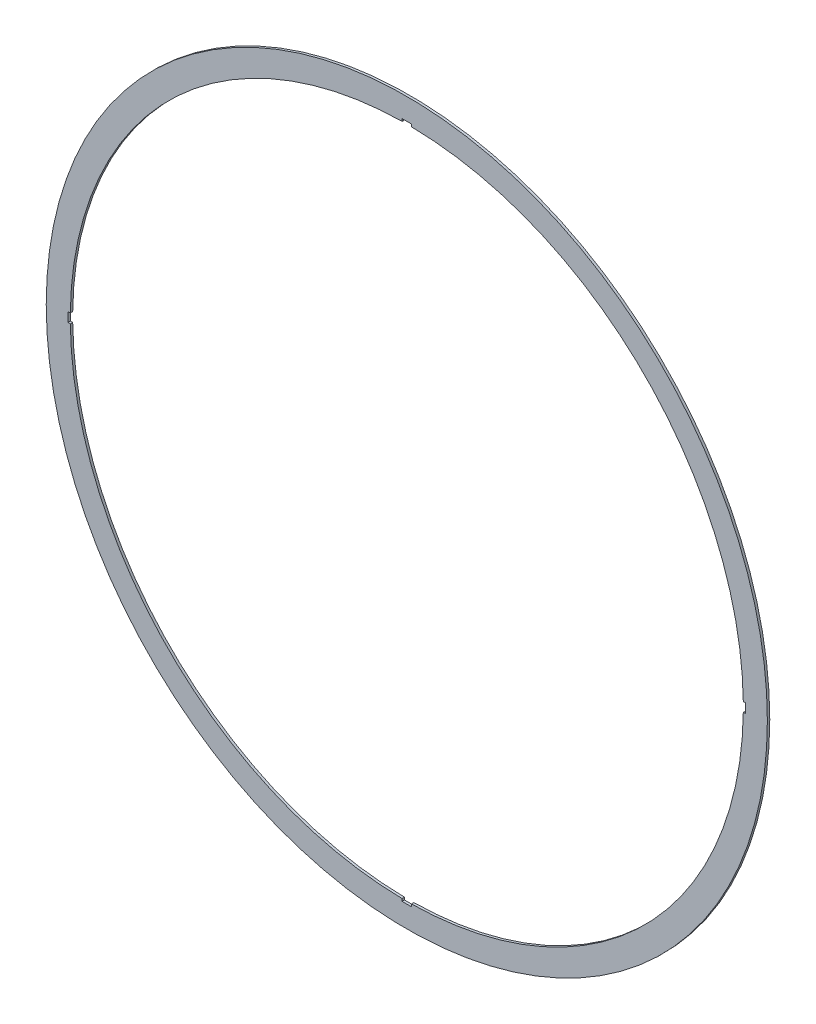
ISO-10303-21;
HEADER;
FILE_DESCRIPTION(('STEP AP214'),'2;1');
FILE_NAME('part.step','',(''),(''),'','','');
FILE_SCHEMA(('AUTOMOTIVE_DESIGN { 1 0 10303 214 1 1 1 1 }'));
ENDSEC;
DATA;
#1=APPLICATION_CONTEXT('core data for automotive mechanical design processes');
#2=APPLICATION_PROTOCOL_DEFINITION('international standard','automotive_design',2000,#1);
#3=PRODUCT_CONTEXT('',#1,'mechanical');
#4=PRODUCT('Part','Part','',(#3));
#5=PRODUCT_RELATED_PRODUCT_CATEGORY('part','',(#4));
#6=PRODUCT_DEFINITION_FORMATION('','',#4);
#7=PRODUCT_DEFINITION_CONTEXT('part definition',#1,'design');
#8=PRODUCT_DEFINITION('design','',#6,#7);
#9=PRODUCT_DEFINITION_SHAPE('','',#8);
#10=(LENGTH_UNIT() NAMED_UNIT(*) SI_UNIT(.MILLI.,.METRE.));
#11=(NAMED_UNIT(*) PLANE_ANGLE_UNIT() SI_UNIT($,.RADIAN.));
#12=(NAMED_UNIT(*) SI_UNIT($,.STERADIAN.) SOLID_ANGLE_UNIT());
#13=UNCERTAINTY_MEASURE_WITH_UNIT(LENGTH_MEASURE(1.E-05),#10,'distance_accuracy_value','');
#14=(GEOMETRIC_REPRESENTATION_CONTEXT(3) GLOBAL_UNCERTAINTY_ASSIGNED_CONTEXT((#13)) GLOBAL_UNIT_ASSIGNED_CONTEXT((#10,
#11,#12)) REPRESENTATION_CONTEXT('',''));
#15=CARTESIAN_POINT('',(0.,0.,0.));
#16=DIRECTION('',(0.,0.,1.));
#17=DIRECTION('',(1.,0.,0.));
#18=AXIS2_PLACEMENT_3D('',#15,#16,#17);
#19=CARTESIAN_POINT('',(0.,0.,3.));
#20=DIRECTION('',(0.,0.,1.));
#21=DIRECTION('',(1.,0.,0.));
#22=AXIS2_PLACEMENT_3D('',#19,#20,#21);
#23=PLANE('',#22);
#24=CARTESIAN_POINT('',(0.,0.,3.));
#25=DIRECTION('',(0.,0.,1.));
#26=DIRECTION('',(1.,0.,0.));
#27=AXIS2_PLACEMENT_3D('',#24,#25,#26);
#28=CIRCLE('',#27,450.);
#29=CARTESIAN_POINT('',(450.,0.,3.));
#30=VERTEX_POINT('',#29);
#31=EDGE_CURVE('E11',#30,#30,#28,.T.);
#32=ORIENTED_EDGE('',*,*,#31,.T.);
#33=EDGE_LOOP('',(#32));
#34=FACE_BOUND('',#33,.T.);
#35=CARTESIAN_POINT('',(0.,0.,3.));
#36=DIRECTION('',(0.,0.,1.));
#37=DIRECTION('',(1.,0.,0.));
#38=AXIS2_PLACEMENT_3D('',#35,#36,#37);
#39=CIRCLE('',#38,420.);
#40=CARTESIAN_POINT('',(-5.86046511627899,419.959111043707,3.));
#41=VERTEX_POINT('',#40);
#42=CARTESIAN_POINT('',(-419.959111043708,5.86046511626075,3.));
#43=VERTEX_POINT('',#42);
#44=EDGE_CURVE('E162',#41,#43,#39,.T.);
#45=ORIENTED_EDGE('',*,*,#44,.F.);
#46=DIRECTION('',(0.,-1.,0.));
#47=VECTOR('',#46,1.);
#48=CARTESIAN_POINT('',(-5.86046511627903,423.000973546597,3.));
#49=LINE('',#48,#47);
#50=CARTESIAN_POINT('',(-5.86046511627903,423.000973546597,3.));
#51=VERTEX_POINT('',#50);
#52=EDGE_CURVE('E153',#51,#41,#49,.T.);
#53=ORIENTED_EDGE('',*,*,#52,.F.);
#54=DIRECTION('',(-1.,0.,0.));
#55=VECTOR('',#54,1.);
#56=CARTESIAN_POINT('',(-5.86046511627903,423.000973546597,3.));
#57=LINE('',#56,#55);
#58=CARTESIAN_POINT('',(5.86046511626083,423.000973546597,3.));
#59=VERTEX_POINT('',#58);
#60=EDGE_CURVE('E217',#59,#51,#57,.T.);
#61=ORIENTED_EDGE('',*,*,#60,.F.);
#62=DIRECTION('',(0.,1.,0.));
#63=VECTOR('',#62,1.);
#64=CARTESIAN_POINT('',(5.86046511626083,423.000973546597,3.));
#65=LINE('',#64,#63);
#66=CARTESIAN_POINT('',(5.86046511626083,419.959111043708,3.));
#67=VERTEX_POINT('',#66);
#68=EDGE_CURVE('E214',#67,#59,#65,.T.);
#69=ORIENTED_EDGE('',*,*,#68,.F.);
#70=CARTESIAN_POINT('',(0.,0.,3.));
#71=DIRECTION('',(0.,0.,1.));
#72=DIRECTION('',(1.,0.,0.));
#73=AXIS2_PLACEMENT_3D('',#70,#71,#72);
#74=CIRCLE('',#73,420.);
#75=CARTESIAN_POINT('',(419.959111043707,5.86046511627906,3.));
#76=VERTEX_POINT('',#75);
#77=EDGE_CURVE('E211',#76,#67,#74,.T.);
#78=ORIENTED_EDGE('',*,*,#77,.F.);
#79=DIRECTION('',(-1.,0.,0.));
#80=VECTOR('',#79,1.);
#81=CARTESIAN_POINT('',(423.000973546597,5.86046511627905,3.));
#82=LINE('',#81,#80);
#83=CARTESIAN_POINT('',(423.000973546597,5.86046511627905,3.));
#84=VERTEX_POINT('',#83);
#85=EDGE_CURVE('E208',#84,#76,#82,.T.);
#86=ORIENTED_EDGE('',*,*,#85,.F.);
#87=DIRECTION('',(0.,1.,0.));
#88=VECTOR('',#87,1.);
#89=CARTESIAN_POINT('',(423.000973546597,5.86046511627905,3.));
#90=LINE('',#89,#88);
#91=CARTESIAN_POINT('',(423.000973546597,-5.8604651162608,3.));
#92=VERTEX_POINT('',#91);
#93=EDGE_CURVE('E205',#92,#84,#90,.T.);
#94=ORIENTED_EDGE('',*,*,#93,.F.);
#95=DIRECTION('',(1.,0.,0.));
#96=VECTOR('',#95,1.);
#97=CARTESIAN_POINT('',(423.000973546597,-5.8604651162608,3.));
#98=LINE('',#97,#96);
#99=CARTESIAN_POINT('',(419.959111043708,-5.86046511626081,3.));
#100=VERTEX_POINT('',#99);
#101=EDGE_CURVE('E202',#100,#92,#98,.T.);
#102=ORIENTED_EDGE('',*,*,#101,.F.);
#103=CARTESIAN_POINT('',(0.,0.,3.));
#104=DIRECTION('',(0.,0.,1.));
#105=DIRECTION('',(1.,0.,0.));
#106=AXIS2_PLACEMENT_3D('',#103,#104,#105);
#107=CIRCLE('',#106,420.);
#108=CARTESIAN_POINT('',(5.86046511627913,-419.959111043707,3.));
#109=VERTEX_POINT('',#108);
#110=EDGE_CURVE('E199',#109,#100,#107,.T.);
#111=ORIENTED_EDGE('',*,*,#110,.F.);
#112=DIRECTION('',(0.,1.,0.));
#113=VECTOR('',#112,1.);
#114=CARTESIAN_POINT('',(5.86046511627908,-423.000973546597,3.));
#115=LINE('',#114,#113);
#116=CARTESIAN_POINT('',(5.86046511627908,-423.000973546597,3.));
#117=VERTEX_POINT('',#116);
#118=EDGE_CURVE('E196',#117,#109,#115,.T.);
#119=ORIENTED_EDGE('',*,*,#118,.F.);
#120=DIRECTION('',(1.,0.,0.));
#121=VECTOR('',#120,1.);
#122=CARTESIAN_POINT('',(5.86046511627908,-423.000973546597,3.));
#123=LINE('',#122,#121);
#124=CARTESIAN_POINT('',(-5.86046511626078,-423.000973546597,3.));
#125=VERTEX_POINT('',#124);
#126=EDGE_CURVE('E193',#125,#117,#123,.T.);
#127=ORIENTED_EDGE('',*,*,#126,.F.);
#128=DIRECTION('',(0.,-1.,0.));
#129=VECTOR('',#128,1.);
#130=CARTESIAN_POINT('',(-5.86046511626078,-423.000973546597,3.));
#131=LINE('',#130,#129);
#132=CARTESIAN_POINT('',(-5.86046511626078,-419.959111043708,3.));
#133=VERTEX_POINT('',#132);
#134=EDGE_CURVE('E190',#133,#125,#131,.T.);
#135=ORIENTED_EDGE('',*,*,#134,.F.);
#136=CARTESIAN_POINT('',(0.,0.,3.));
#137=DIRECTION('',(0.,0.,1.));
#138=DIRECTION('',(1.,0.,0.));
#139=AXIS2_PLACEMENT_3D('',#136,#137,#138);
#140=CIRCLE('',#139,420.);
#141=CARTESIAN_POINT('',(-419.959111043707,-5.86046511627897,3.));
#142=VERTEX_POINT('',#141);
#143=EDGE_CURVE('E187',#142,#133,#140,.T.);
#144=ORIENTED_EDGE('',*,*,#143,.F.);
#145=DIRECTION('',(1.,0.,0.));
#146=VECTOR('',#145,1.);
#147=CARTESIAN_POINT('',(-423.000973546597,-5.86046511627911,3.));
#148=LINE('',#147,#146);
#149=CARTESIAN_POINT('',(-423.000973546597,-5.86046511627911,3.));
#150=VERTEX_POINT('',#149);
#151=EDGE_CURVE('E184',#150,#142,#148,.T.);
#152=ORIENTED_EDGE('',*,*,#151,.F.);
#153=DIRECTION('',(0.,-1.,0.));
#154=VECTOR('',#153,1.);
#155=CARTESIAN_POINT('',(-423.000973546597,-5.86046511627911,3.));
#156=LINE('',#155,#154);
#157=CARTESIAN_POINT('',(-423.000973546597,5.86046511626075,3.));
#158=VERTEX_POINT('',#157);
#159=EDGE_CURVE('E179',#158,#150,#156,.T.);
#160=ORIENTED_EDGE('',*,*,#159,.F.);
#161=DIRECTION('',(-1.,0.,0.));
#162=VECTOR('',#161,1.);
#163=CARTESIAN_POINT('',(-423.000973546597,5.86046511626075,3.));
#164=LINE('',#163,#162);
#165=EDGE_CURVE('E175',#43,#158,#164,.T.);
#166=ORIENTED_EDGE('',*,*,#165,.F.);
#167=EDGE_LOOP('',(#45,#53,#61,#69,#78,#86,#94,#102,#111,#119,#127,#135,#144,#152,#160,#166));
#168=FACE_BOUND('',#167,.T.);
#169=ADVANCED_FACE('F39',(#34,#168),#23,.T.);
#170=CARTESIAN_POINT('',(0.,0.,0.));
#171=DIRECTION('',(0.,0.,1.));
#172=DIRECTION('',(1.,0.,0.));
#173=AXIS2_PLACEMENT_3D('',#170,#171,#172);
#174=PLANE('',#173);
#175=CARTESIAN_POINT('',(0.,0.,0.));
#176=DIRECTION('',(0.,0.,1.));
#177=DIRECTION('',(1.,0.,0.));
#178=AXIS2_PLACEMENT_3D('',#175,#176,#177);
#179=CIRCLE('',#178,450.);
#180=CARTESIAN_POINT('',(450.,0.,0.));
#181=VERTEX_POINT('',#180);
#182=EDGE_CURVE('E43',#181,#181,#179,.T.);
#183=ORIENTED_EDGE('',*,*,#182,.F.);
#184=EDGE_LOOP('',(#183));
#185=FACE_BOUND('',#184,.T.);
#186=DIRECTION('',(0.,-1.,0.));
#187=VECTOR('',#186,1.);
#188=CARTESIAN_POINT('',(-5.86046511627903,423.000973546597,0.));
#189=LINE('',#188,#187);
#190=CARTESIAN_POINT('',(-5.86046511627903,423.000973546597,0.));
#191=VERTEX_POINT('',#190);
#192=CARTESIAN_POINT('',(-5.86046511627899,419.959111043707,0.));
#193=VERTEX_POINT('',#192);
#194=EDGE_CURVE('E63',#191,#193,#189,.T.);
#195=ORIENTED_EDGE('',*,*,#194,.T.);
#196=CARTESIAN_POINT('',(0.,0.,0.));
#197=DIRECTION('',(0.,0.,1.));
#198=DIRECTION('',(1.,0.,0.));
#199=AXIS2_PLACEMENT_3D('',#196,#197,#198);
#200=CIRCLE('',#199,420.);
#201=CARTESIAN_POINT('',(-419.959111043708,5.86046511626075,0.));
#202=VERTEX_POINT('',#201);
#203=EDGE_CURVE('E169',#193,#202,#200,.T.);
#204=ORIENTED_EDGE('',*,*,#203,.T.);
#205=DIRECTION('',(-1.,0.,0.));
#206=VECTOR('',#205,1.);
#207=CARTESIAN_POINT('',(-423.000973546597,5.86046511626075,0.));
#208=LINE('',#207,#206);
#209=CARTESIAN_POINT('',(-423.000973546597,5.86046511626075,0.));
#210=VERTEX_POINT('',#209);
#211=EDGE_CURVE('E224',#202,#210,#208,.T.);
#212=ORIENTED_EDGE('',*,*,#211,.T.);
#213=DIRECTION('',(0.,-1.,0.));
#214=VECTOR('',#213,1.);
#215=CARTESIAN_POINT('',(-423.000973546597,-5.86046511627911,0.));
#216=LINE('',#215,#214);
#217=CARTESIAN_POINT('',(-423.000973546597,-5.86046511627911,0.));
#218=VERTEX_POINT('',#217);
#219=EDGE_CURVE('E228',#210,#218,#216,.T.);
#220=ORIENTED_EDGE('',*,*,#219,.T.);
#221=DIRECTION('',(1.,0.,0.));
#222=VECTOR('',#221,1.);
#223=CARTESIAN_POINT('',(-423.000973546597,-5.86046511627911,0.));
#224=LINE('',#223,#222);
#225=CARTESIAN_POINT('',(-419.959111043707,-5.86046511627897,0.));
#226=VERTEX_POINT('',#225);
#227=EDGE_CURVE('E232',#218,#226,#224,.T.);
#228=ORIENTED_EDGE('',*,*,#227,.T.);
#229=CARTESIAN_POINT('',(0.,0.,0.));
#230=DIRECTION('',(0.,0.,1.));
#231=DIRECTION('',(1.,0.,0.));
#232=AXIS2_PLACEMENT_3D('',#229,#230,#231);
#233=CIRCLE('',#232,420.);
#234=CARTESIAN_POINT('',(-5.86046511626078,-419.959111043708,0.));
#235=VERTEX_POINT('',#234);
#236=EDGE_CURVE('E236',#226,#235,#233,.T.);
#237=ORIENTED_EDGE('',*,*,#236,.T.);
#238=DIRECTION('',(0.,-1.,0.));
#239=VECTOR('',#238,1.);
#240=CARTESIAN_POINT('',(-5.86046511626078,-423.000973546597,0.));
#241=LINE('',#240,#239);
#242=CARTESIAN_POINT('',(-5.86046511626078,-423.000973546597,0.));
#243=VERTEX_POINT('',#242);
#244=EDGE_CURVE('E240',#235,#243,#241,.T.);
#245=ORIENTED_EDGE('',*,*,#244,.T.);
#246=DIRECTION('',(1.,0.,0.));
#247=VECTOR('',#246,1.);
#248=CARTESIAN_POINT('',(5.86046511627908,-423.000973546597,0.));
#249=LINE('',#248,#247);
#250=CARTESIAN_POINT('',(5.86046511627908,-423.000973546597,0.));
#251=VERTEX_POINT('',#250);
#252=EDGE_CURVE('E244',#243,#251,#249,.T.);
#253=ORIENTED_EDGE('',*,*,#252,.T.);
#254=DIRECTION('',(0.,1.,0.));
#255=VECTOR('',#254,1.);
#256=CARTESIAN_POINT('',(5.86046511627908,-423.000973546597,0.));
#257=LINE('',#256,#255);
#258=CARTESIAN_POINT('',(5.86046511627913,-419.959111043707,0.));
#259=VERTEX_POINT('',#258);
#260=EDGE_CURVE('E248',#251,#259,#257,.T.);
#261=ORIENTED_EDGE('',*,*,#260,.T.);
#262=CARTESIAN_POINT('',(0.,0.,0.));
#263=DIRECTION('',(0.,0.,1.));
#264=DIRECTION('',(1.,0.,0.));
#265=AXIS2_PLACEMENT_3D('',#262,#263,#264);
#266=CIRCLE('',#265,420.);
#267=CARTESIAN_POINT('',(419.959111043708,-5.86046511626081,0.));
#268=VERTEX_POINT('',#267);
#269=EDGE_CURVE('E252',#259,#268,#266,.T.);
#270=ORIENTED_EDGE('',*,*,#269,.T.);
#271=DIRECTION('',(1.,0.,0.));
#272=VECTOR('',#271,1.);
#273=CARTESIAN_POINT('',(423.000973546597,-5.8604651162608,0.));
#274=LINE('',#273,#272);
#275=CARTESIAN_POINT('',(423.000973546597,-5.8604651162608,0.));
#276=VERTEX_POINT('',#275);
#277=EDGE_CURVE('E256',#268,#276,#274,.T.);
#278=ORIENTED_EDGE('',*,*,#277,.T.);
#279=DIRECTION('',(0.,1.,0.));
#280=VECTOR('',#279,1.);
#281=CARTESIAN_POINT('',(423.000973546597,5.86046511627905,0.));
#282=LINE('',#281,#280);
#283=CARTESIAN_POINT('',(423.000973546597,5.86046511627905,0.));
#284=VERTEX_POINT('',#283);
#285=EDGE_CURVE('E260',#276,#284,#282,.T.);
#286=ORIENTED_EDGE('',*,*,#285,.T.);
#287=DIRECTION('',(-1.,0.,0.));
#288=VECTOR('',#287,1.);
#289=CARTESIAN_POINT('',(423.000973546597,5.86046511627905,0.));
#290=LINE('',#289,#288);
#291=CARTESIAN_POINT('',(419.959111043707,5.86046511627906,0.));
#292=VERTEX_POINT('',#291);
#293=EDGE_CURVE('E264',#284,#292,#290,.T.);
#294=ORIENTED_EDGE('',*,*,#293,.T.);
#295=CARTESIAN_POINT('',(0.,0.,0.));
#296=DIRECTION('',(0.,0.,1.));
#297=DIRECTION('',(1.,0.,0.));
#298=AXIS2_PLACEMENT_3D('',#295,#296,#297);
#299=CIRCLE('',#298,420.);
#300=CARTESIAN_POINT('',(5.86046511626083,419.959111043708,0.));
#301=VERTEX_POINT('',#300);
#302=EDGE_CURVE('E268',#292,#301,#299,.T.);
#303=ORIENTED_EDGE('',*,*,#302,.T.);
#304=DIRECTION('',(0.,1.,0.));
#305=VECTOR('',#304,1.);
#306=CARTESIAN_POINT('',(5.86046511626083,423.000973546597,0.));
#307=LINE('',#306,#305);
#308=CARTESIAN_POINT('',(5.86046511626083,423.000973546597,0.));
#309=VERTEX_POINT('',#308);
#310=EDGE_CURVE('E272',#301,#309,#307,.T.);
#311=ORIENTED_EDGE('',*,*,#310,.T.);
#312=DIRECTION('',(-1.,0.,0.));
#313=VECTOR('',#312,1.);
#314=CARTESIAN_POINT('',(-5.86046511627903,423.000973546597,0.));
#315=LINE('',#314,#313);
#316=EDGE_CURVE('E163',#309,#191,#315,.T.);
#317=ORIENTED_EDGE('',*,*,#316,.T.);
#318=EDGE_LOOP('',(#195,#204,#212,#220,#228,#237,#245,#253,#261,#270,#278,#286,#294,#303,#311,#317));
#319=FACE_BOUND('',#318,.T.);
#320=ADVANCED_FACE('F326',(#185,#319),#174,.F.);
#321=CARTESIAN_POINT('',(0.,0.,3.));
#322=DIRECTION('',(0.,0.,-1.));
#323=DIRECTION('',(-1.,0.,0.));
#324=AXIS2_PLACEMENT_3D('',#321,#322,#323);
#325=CYLINDRICAL_SURFACE('',#324,450.);
#326=ORIENTED_EDGE('',*,*,#31,.F.);
#327=EDGE_LOOP('',(#326));
#328=FACE_BOUND('',#327,.T.);
#329=ORIENTED_EDGE('',*,*,#182,.T.);
#330=EDGE_LOOP('',(#329));
#331=FACE_BOUND('',#330,.T.);
#332=ADVANCED_FACE('F41',(#328,#331),#325,.T.);
#333=CARTESIAN_POINT('',(-5.86046511627903,423.000973546597,3.));
#334=DIRECTION('',(1.,0.,0.));
#335=DIRECTION('',(0.,0.,-1.));
#336=AXIS2_PLACEMENT_3D('',#333,#334,#335);
#337=PLANE('',#336);
#338=ORIENTED_EDGE('',*,*,#194,.F.);
#339=DIRECTION('',(0.,0.,-1.));
#340=VECTOR('',#339,1.);
#341=CARTESIAN_POINT('',(-5.86046511627903,423.000973546597,3.));
#342=LINE('',#341,#340);
#343=EDGE_CURVE('E157',#51,#191,#342,.T.);
#344=ORIENTED_EDGE('',*,*,#343,.F.);
#345=ORIENTED_EDGE('',*,*,#52,.T.);
#346=DIRECTION('',(0.,0.,-1.));
#347=VECTOR('',#346,1.);
#348=CARTESIAN_POINT('',(-5.86046511627899,419.959111043707,3.));
#349=LINE('',#348,#347);
#350=EDGE_CURVE('E156',#41,#193,#349,.T.);
#351=ORIENTED_EDGE('',*,*,#350,.T.);
#352=EDGE_LOOP('',(#338,#344,#345,#351));
#353=FACE_BOUND('',#352,.T.);
#354=ADVANCED_FACE('F155',(#353),#337,.T.);
#355=CARTESIAN_POINT('',(0.,0.,3.));
#356=DIRECTION('',(0.,0.,-1.));
#357=DIRECTION('',(-1.,0.,0.));
#358=AXIS2_PLACEMENT_3D('',#355,#356,#357);
#359=CYLINDRICAL_SURFACE('',#358,420.);
#360=ORIENTED_EDGE('',*,*,#203,.F.);
#361=ORIENTED_EDGE('',*,*,#350,.F.);
#362=ORIENTED_EDGE('',*,*,#44,.T.);
#363=DIRECTION('',(0.,0.,-1.));
#364=VECTOR('',#363,1.);
#365=CARTESIAN_POINT('',(-419.959111043708,5.86046511626075,3.));
#366=LINE('',#365,#364);
#367=EDGE_CURVE('E171',#43,#202,#366,.T.);
#368=ORIENTED_EDGE('',*,*,#367,.T.);
#369=EDGE_LOOP('',(#360,#361,#362,#368));
#370=FACE_BOUND('',#369,.T.);
#371=ADVANCED_FACE('F166',(#370),#359,.F.);
#372=CARTESIAN_POINT('',(-423.000973546597,5.86046511626075,3.));
#373=DIRECTION('',(0.,-1.,0.));
#374=DIRECTION('',(1.,0.,0.));
#375=AXIS2_PLACEMENT_3D('',#372,#373,#374);
#376=PLANE('',#375);
#377=ORIENTED_EDGE('',*,*,#211,.F.);
#378=ORIENTED_EDGE('',*,*,#367,.F.);
#379=ORIENTED_EDGE('',*,*,#165,.T.);
#380=DIRECTION('',(0.,0.,-1.));
#381=VECTOR('',#380,1.);
#382=CARTESIAN_POINT('',(-423.000973546597,5.86046511626075,3.));
#383=LINE('',#382,#381);
#384=EDGE_CURVE('E316',#158,#210,#383,.T.);
#385=ORIENTED_EDGE('',*,*,#384,.T.);
#386=EDGE_LOOP('',(#377,#378,#379,#385));
#387=FACE_BOUND('',#386,.T.);
#388=ADVANCED_FACE('F322',(#387),#376,.T.);
#389=CARTESIAN_POINT('',(-423.000973546597,-5.86046511627911,3.));
#390=DIRECTION('',(1.,0.,0.));
#391=DIRECTION('',(0.,0.,-1.));
#392=AXIS2_PLACEMENT_3D('',#389,#390,#391);
#393=PLANE('',#392);
#394=ORIENTED_EDGE('',*,*,#219,.F.);
#395=ORIENTED_EDGE('',*,*,#384,.F.);
#396=ORIENTED_EDGE('',*,*,#159,.T.);
#397=DIRECTION('',(0.,0.,-1.));
#398=VECTOR('',#397,1.);
#399=CARTESIAN_POINT('',(-423.000973546597,-5.86046511627911,3.));
#400=LINE('',#399,#398);
#401=EDGE_CURVE('E313',#150,#218,#400,.T.);
#402=ORIENTED_EDGE('',*,*,#401,.T.);
#403=EDGE_LOOP('',(#394,#395,#396,#402));
#404=FACE_BOUND('',#403,.T.);
#405=ADVANCED_FACE('F384',(#404),#393,.T.);
#406=CARTESIAN_POINT('',(-423.000973546597,-5.86046511627911,3.));
#407=DIRECTION('',(0.,1.,0.));
#408=DIRECTION('',(-1.,0.,0.));
#409=AXIS2_PLACEMENT_3D('',#406,#407,#408);
#410=PLANE('',#409);
#411=ORIENTED_EDGE('',*,*,#227,.F.);
#412=ORIENTED_EDGE('',*,*,#401,.F.);
#413=ORIENTED_EDGE('',*,*,#151,.T.);
#414=DIRECTION('',(0.,0.,-1.));
#415=VECTOR('',#414,1.);
#416=CARTESIAN_POINT('',(-419.959111043707,-5.86046511627897,3.));
#417=LINE('',#416,#415);
#418=EDGE_CURVE('E310',#142,#226,#417,.T.);
#419=ORIENTED_EDGE('',*,*,#418,.T.);
#420=EDGE_LOOP('',(#411,#412,#413,#419));
#421=FACE_BOUND('',#420,.T.);
#422=ADVANCED_FACE('F381',(#421),#410,.T.);
#423=CARTESIAN_POINT('',(0.,0.,3.));
#424=DIRECTION('',(0.,0.,-1.));
#425=DIRECTION('',(-1.,0.,0.));
#426=AXIS2_PLACEMENT_3D('',#423,#424,#425);
#427=CYLINDRICAL_SURFACE('',#426,420.);
#428=ORIENTED_EDGE('',*,*,#236,.F.);
#429=ORIENTED_EDGE('',*,*,#418,.F.);
#430=ORIENTED_EDGE('',*,*,#143,.T.);
#431=DIRECTION('',(0.,0.,-1.));
#432=VECTOR('',#431,1.);
#433=CARTESIAN_POINT('',(-5.86046511626078,-419.959111043708,3.));
#434=LINE('',#433,#432);
#435=EDGE_CURVE('E307',#133,#235,#434,.T.);
#436=ORIENTED_EDGE('',*,*,#435,.T.);
#437=EDGE_LOOP('',(#428,#429,#430,#436));
#438=FACE_BOUND('',#437,.T.);
#439=ADVANCED_FACE('F378',(#438),#427,.F.);
#440=CARTESIAN_POINT('',(-5.86046511626078,-423.000973546597,3.));
#441=DIRECTION('',(1.,0.,0.));
#442=DIRECTION('',(0.,1.,0.));
#443=AXIS2_PLACEMENT_3D('',#440,#441,#442);
#444=PLANE('',#443);
#445=ORIENTED_EDGE('',*,*,#244,.F.);
#446=ORIENTED_EDGE('',*,*,#435,.F.);
#447=ORIENTED_EDGE('',*,*,#134,.T.);
#448=DIRECTION('',(0.,0.,-1.));
#449=VECTOR('',#448,1.);
#450=CARTESIAN_POINT('',(-5.86046511626078,-423.000973546597,3.));
#451=LINE('',#450,#449);
#452=EDGE_CURVE('E304',#125,#243,#451,.T.);
#453=ORIENTED_EDGE('',*,*,#452,.T.);
#454=EDGE_LOOP('',(#445,#446,#447,#453));
#455=FACE_BOUND('',#454,.T.);
#456=ADVANCED_FACE('F371',(#455),#444,.T.);
#457=CARTESIAN_POINT('',(5.86046511627908,-423.000973546597,3.));
#458=DIRECTION('',(0.,1.,0.));
#459=DIRECTION('',(0.,0.,1.));
#460=AXIS2_PLACEMENT_3D('',#457,#458,#459);
#461=PLANE('',#460);
#462=ORIENTED_EDGE('',*,*,#252,.F.);
#463=ORIENTED_EDGE('',*,*,#452,.F.);
#464=ORIENTED_EDGE('',*,*,#126,.T.);
#465=DIRECTION('',(0.,0.,-1.));
#466=VECTOR('',#465,1.);
#467=CARTESIAN_POINT('',(5.86046511627908,-423.000973546597,3.));
#468=LINE('',#467,#466);
#469=EDGE_CURVE('E301',#117,#251,#468,.T.);
#470=ORIENTED_EDGE('',*,*,#469,.T.);
#471=EDGE_LOOP('',(#462,#463,#464,#470));
#472=FACE_BOUND('',#471,.T.);
#473=ADVANCED_FACE('F367',(#472),#461,.T.);
#474=CARTESIAN_POINT('',(5.86046511627908,-423.000973546597,3.));
#475=DIRECTION('',(-1.,0.,0.));
#476=DIRECTION('',(0.,-1.,0.));
#477=AXIS2_PLACEMENT_3D('',#474,#475,#476);
#478=PLANE('',#477);
#479=ORIENTED_EDGE('',*,*,#260,.F.);
#480=ORIENTED_EDGE('',*,*,#469,.F.);
#481=ORIENTED_EDGE('',*,*,#118,.T.);
#482=DIRECTION('',(0.,0.,-1.));
#483=VECTOR('',#482,1.);
#484=CARTESIAN_POINT('',(5.86046511627913,-419.959111043707,3.));
#485=LINE('',#484,#483);
#486=EDGE_CURVE('E298',#109,#259,#485,.T.);
#487=ORIENTED_EDGE('',*,*,#486,.T.);
#488=EDGE_LOOP('',(#479,#480,#481,#487));
#489=FACE_BOUND('',#488,.T.);
#490=ADVANCED_FACE('F364',(#489),#478,.T.);
#491=CARTESIAN_POINT('',(0.,0.,3.));
#492=DIRECTION('',(0.,0.,-1.));
#493=DIRECTION('',(-1.,0.,0.));
#494=AXIS2_PLACEMENT_3D('',#491,#492,#493);
#495=CYLINDRICAL_SURFACE('',#494,420.);
#496=ORIENTED_EDGE('',*,*,#269,.F.);
#497=ORIENTED_EDGE('',*,*,#486,.F.);
#498=ORIENTED_EDGE('',*,*,#110,.T.);
#499=DIRECTION('',(0.,0.,-1.));
#500=VECTOR('',#499,1.);
#501=CARTESIAN_POINT('',(419.959111043708,-5.86046511626081,3.));
#502=LINE('',#501,#500);
#503=EDGE_CURVE('E295',#100,#268,#502,.T.);
#504=ORIENTED_EDGE('',*,*,#503,.T.);
#505=EDGE_LOOP('',(#496,#497,#498,#504));
#506=FACE_BOUND('',#505,.T.);
#507=ADVANCED_FACE('F356',(#506),#495,.F.);
#508=CARTESIAN_POINT('',(423.000973546597,-5.8604651162608,3.));
#509=DIRECTION('',(0.,1.,0.));
#510=DIRECTION('',(-1.,0.,0.));
#511=AXIS2_PLACEMENT_3D('',#508,#509,#510);
#512=PLANE('',#511);
#513=ORIENTED_EDGE('',*,*,#277,.F.);
#514=ORIENTED_EDGE('',*,*,#503,.F.);
#515=ORIENTED_EDGE('',*,*,#101,.T.);
#516=DIRECTION('',(0.,0.,-1.));
#517=VECTOR('',#516,1.);
#518=CARTESIAN_POINT('',(423.000973546597,-5.8604651162608,3.));
#519=LINE('',#518,#517);
#520=EDGE_CURVE('E292',#92,#276,#519,.T.);
#521=ORIENTED_EDGE('',*,*,#520,.T.);
#522=EDGE_LOOP('',(#513,#514,#515,#521));
#523=FACE_BOUND('',#522,.T.);
#524=ADVANCED_FACE('F352',(#523),#512,.T.);
#525=CARTESIAN_POINT('',(423.000973546597,5.86046511627905,3.));
#526=DIRECTION('',(-1.,0.,0.));
#527=DIRECTION('',(0.,0.,1.));
#528=AXIS2_PLACEMENT_3D('',#525,#526,#527);
#529=PLANE('',#528);
#530=ORIENTED_EDGE('',*,*,#285,.F.);
#531=ORIENTED_EDGE('',*,*,#520,.F.);
#532=ORIENTED_EDGE('',*,*,#93,.T.);
#533=DIRECTION('',(0.,0.,-1.));
#534=VECTOR('',#533,1.);
#535=CARTESIAN_POINT('',(423.000973546597,5.86046511627905,3.));
#536=LINE('',#535,#534);
#537=EDGE_CURVE('E289',#84,#284,#536,.T.);
#538=ORIENTED_EDGE('',*,*,#537,.T.);
#539=EDGE_LOOP('',(#530,#531,#532,#538));
#540=FACE_BOUND('',#539,.T.);
#541=ADVANCED_FACE('F349',(#540),#529,.T.);
#542=CARTESIAN_POINT('',(423.000973546597,5.86046511627905,3.));
#543=DIRECTION('',(0.,-1.,0.));
#544=DIRECTION('',(0.,0.,-1.));
#545=AXIS2_PLACEMENT_3D('',#542,#543,#544);
#546=PLANE('',#545);
#547=ORIENTED_EDGE('',*,*,#293,.F.);
#548=ORIENTED_EDGE('',*,*,#537,.F.);
#549=ORIENTED_EDGE('',*,*,#85,.T.);
#550=DIRECTION('',(0.,0.,-1.));
#551=VECTOR('',#550,1.);
#552=CARTESIAN_POINT('',(419.959111043707,5.86046511627906,3.));
#553=LINE('',#552,#551);
#554=EDGE_CURVE('E286',#76,#292,#553,.T.);
#555=ORIENTED_EDGE('',*,*,#554,.T.);
#556=EDGE_LOOP('',(#547,#548,#549,#555));
#557=FACE_BOUND('',#556,.T.);
#558=ADVANCED_FACE('F341',(#557),#546,.T.);
#559=CARTESIAN_POINT('',(0.,0.,3.));
#560=DIRECTION('',(0.,0.,-1.));
#561=DIRECTION('',(-1.,0.,0.));
#562=AXIS2_PLACEMENT_3D('',#559,#560,#561);
#563=CYLINDRICAL_SURFACE('',#562,420.);
#564=ORIENTED_EDGE('',*,*,#302,.F.);
#565=ORIENTED_EDGE('',*,*,#554,.F.);
#566=ORIENTED_EDGE('',*,*,#77,.T.);
#567=DIRECTION('',(0.,0.,-1.));
#568=VECTOR('',#567,1.);
#569=CARTESIAN_POINT('',(5.86046511626083,419.959111043708,3.));
#570=LINE('',#569,#568);
#571=EDGE_CURVE('E283',#67,#301,#570,.T.);
#572=ORIENTED_EDGE('',*,*,#571,.T.);
#573=EDGE_LOOP('',(#564,#565,#566,#572));
#574=FACE_BOUND('',#573,.T.);
#575=ADVANCED_FACE('F337',(#574),#563,.F.);
#576=CARTESIAN_POINT('',(5.86046511626083,423.000973546597,3.));
#577=DIRECTION('',(-1.,0.,0.));
#578=DIRECTION('',(0.,-1.,0.));
#579=AXIS2_PLACEMENT_3D('',#576,#577,#578);
#580=PLANE('',#579);
#581=ORIENTED_EDGE('',*,*,#310,.F.);
#582=ORIENTED_EDGE('',*,*,#571,.F.);
#583=ORIENTED_EDGE('',*,*,#68,.T.);
#584=DIRECTION('',(0.,0.,-1.));
#585=VECTOR('',#584,1.);
#586=CARTESIAN_POINT('',(5.86046511626083,423.000973546597,3.));
#587=LINE('',#586,#585);
#588=EDGE_CURVE('E55',#59,#309,#587,.T.);
#589=ORIENTED_EDGE('',*,*,#588,.T.);
#590=EDGE_LOOP('',(#581,#582,#583,#589));
#591=FACE_BOUND('',#590,.T.);
#592=ADVANCED_FACE('F334',(#591),#580,.T.);
#593=CARTESIAN_POINT('',(-5.86046511627903,423.000973546597,3.));
#594=DIRECTION('',(0.,-1.,0.));
#595=DIRECTION('',(0.,0.,-1.));
#596=AXIS2_PLACEMENT_3D('',#593,#594,#595);
#597=PLANE('',#596);
#598=ORIENTED_EDGE('',*,*,#316,.F.);
#599=ORIENTED_EDGE('',*,*,#588,.F.);
#600=ORIENTED_EDGE('',*,*,#60,.T.);
#601=ORIENTED_EDGE('',*,*,#343,.T.);
#602=EDGE_LOOP('',(#598,#599,#600,#601));
#603=FACE_BOUND('',#602,.T.);
#604=ADVANCED_FACE('F328',(#603),#597,.T.);
#605=CLOSED_SHELL('',(#169,#320,#332,#354,#371,#388,#405,#422,#439,#456,#473,#490,#507,#524,
#541,#558,#575,#592,#604));
#606=MANIFOLD_SOLID_BREP('B2',#605);
#607=ADVANCED_BREP_SHAPE_REPRESENTATION('',(#18,#606),#14);
#608=SHAPE_DEFINITION_REPRESENTATION(#9,#607);
ENDSEC;
END-ISO-10303-21;
